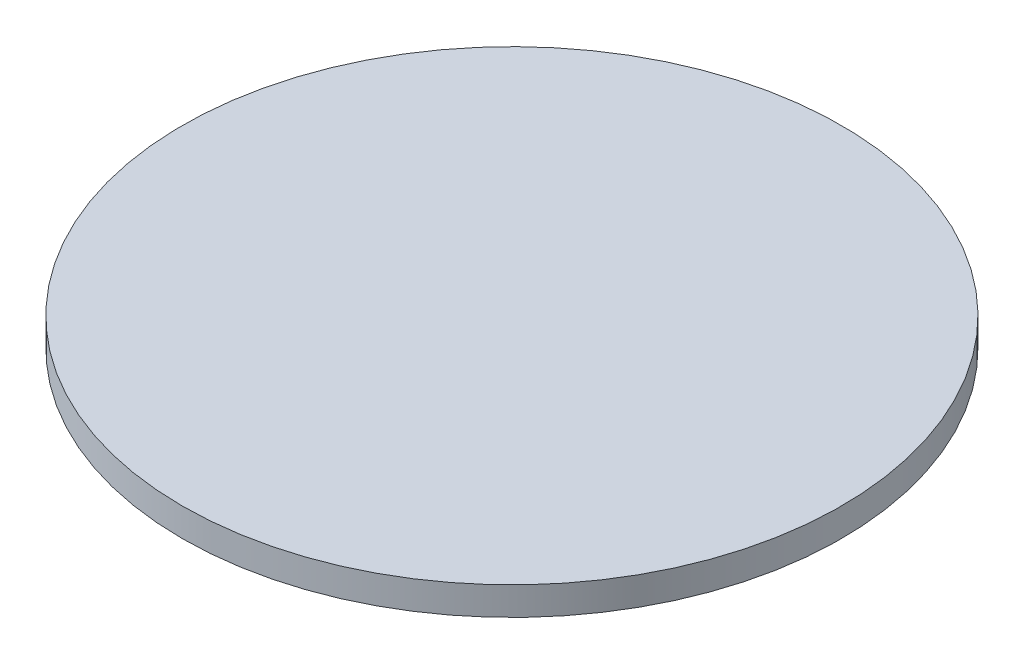
ISO-10303-21;
HEADER;
FILE_DESCRIPTION(('STEP AP214'),'2;1');
FILE_NAME('part.step','',(''),(''),'','','');
FILE_SCHEMA(('AUTOMOTIVE_DESIGN { 1 0 10303 214 1 1 1 1 }'));
ENDSEC;
DATA;
#1=APPLICATION_CONTEXT('core data for automotive mechanical design processes');
#2=APPLICATION_PROTOCOL_DEFINITION('international standard','automotive_design',2000,#1);
#3=PRODUCT_CONTEXT('',#1,'mechanical');
#4=PRODUCT('Part','Part','',(#3));
#5=PRODUCT_RELATED_PRODUCT_CATEGORY('part','',(#4));
#6=PRODUCT_DEFINITION_FORMATION('','',#4);
#7=PRODUCT_DEFINITION_CONTEXT('part definition',#1,'design');
#8=PRODUCT_DEFINITION('design','',#6,#7);
#9=PRODUCT_DEFINITION_SHAPE('','',#8);
#10=(LENGTH_UNIT() NAMED_UNIT(*) SI_UNIT(.MILLI.,.METRE.));
#11=(NAMED_UNIT(*) PLANE_ANGLE_UNIT() SI_UNIT($,.RADIAN.));
#12=(NAMED_UNIT(*) SI_UNIT($,.STERADIAN.) SOLID_ANGLE_UNIT());
#13=UNCERTAINTY_MEASURE_WITH_UNIT(LENGTH_MEASURE(1.E-05),#10,'distance_accuracy_value','');
#14=(GEOMETRIC_REPRESENTATION_CONTEXT(3) GLOBAL_UNCERTAINTY_ASSIGNED_CONTEXT((#13)) GLOBAL_UNIT_ASSIGNED_CONTEXT((#10,
#11,#12)) REPRESENTATION_CONTEXT('',''));
#15=CARTESIAN_POINT('',(0.,0.,0.));
#16=DIRECTION('',(0.,0.,1.));
#17=DIRECTION('',(1.,0.,0.));
#18=AXIS2_PLACEMENT_3D('',#15,#16,#17);
#19=CARTESIAN_POINT('',(0.,0.,0.));
#20=DIRECTION('',(0.,1.,0.));
#21=DIRECTION('',(0.,0.,1.));
#22=AXIS2_PLACEMENT_3D('',#19,#20,#21);
#23=CONICAL_SURFACE('',#22,2.5,0.463647609000806);
#24=CARTESIAN_POINT('',(0.,5.,0.));
#25=DIRECTION('',(0.,1.,0.));
#26=DIRECTION('',(0.,0.,1.));
#27=AXIS2_PLACEMENT_3D('',#24,#25,#26);
#28=CIRCLE('',#27,5.);
#29=CARTESIAN_POINT('',(0.,5.,5.));
#30=VERTEX_POINT('',#29);
#31=EDGE_CURVE('E55',#30,#30,#28,.T.);
#32=ORIENTED_EDGE('',*,*,#31,.F.);
#33=EDGE_LOOP('',(#32));
#34=FACE_BOUND('',#33,.T.);
#35=CARTESIAN_POINT('',(0.,0.,0.));
#36=DIRECTION('',(0.,-1.,0.));
#37=DIRECTION('',(0.,0.,-1.));
#38=AXIS2_PLACEMENT_3D('',#35,#36,#37);
#39=CIRCLE('',#38,2.5);
#40=CARTESIAN_POINT('',(0.,0.,-2.5));
#41=VERTEX_POINT('',#40);
#42=EDGE_CURVE('E50',#41,#41,#39,.T.);
#43=ORIENTED_EDGE('',*,*,#42,.F.);
#44=EDGE_LOOP('',(#43));
#45=FACE_BOUND('',#44,.T.);
#46=ADVANCED_FACE('F42',(#34,#45),#23,.T.);
#47=CARTESIAN_POINT('',(0.,0.,0.));
#48=DIRECTION('',(0.,-1.,0.));
#49=DIRECTION('',(0.,0.,-1.));
#50=AXIS2_PLACEMENT_3D('',#47,#48,#49);
#51=PLANE('',#50);
#52=CARTESIAN_POINT('',(0.,0.,0.));
#53=DIRECTION('',(0.,-1.,0.));
#54=DIRECTION('',(0.,0.,-1.));
#55=AXIS2_PLACEMENT_3D('',#52,#53,#54);
#56=CIRCLE('',#55,1.7);
#57=CARTESIAN_POINT('',(0.,0.,-1.7));
#58=VERTEX_POINT('',#57);
#59=EDGE_CURVE('E71',#58,#58,#56,.T.);
#60=ORIENTED_EDGE('',*,*,#59,.F.);
#61=EDGE_LOOP('',(#60));
#62=FACE_BOUND('',#61,.T.);
#63=ORIENTED_EDGE('',*,*,#42,.T.);
#64=EDGE_LOOP('',(#63));
#65=FACE_BOUND('',#64,.T.);
#66=ADVANCED_FACE('F88',(#62,#65),#51,.T.);
#67=CARTESIAN_POINT('',(0.,11.5,0.));
#68=DIRECTION('',(0.,-1.,0.));
#69=DIRECTION('',(0.,0.,-1.));
#70=AXIS2_PLACEMENT_3D('',#67,#68,#69);
#71=CYLINDRICAL_SURFACE('',#70,17.5);
#72=CARTESIAN_POINT('',(0.,11.5,0.));
#73=DIRECTION('',(0.,1.,0.));
#74=DIRECTION('',(0.,0.,1.));
#75=AXIS2_PLACEMENT_3D('',#72,#73,#74);
#76=CIRCLE('',#75,17.5);
#77=CARTESIAN_POINT('',(0.,11.5,17.5));
#78=VERTEX_POINT('',#77);
#79=EDGE_CURVE('E60',#78,#78,#76,.T.);
#80=ORIENTED_EDGE('',*,*,#79,.F.);
#81=EDGE_LOOP('',(#80));
#82=FACE_BOUND('',#81,.T.);
#83=CARTESIAN_POINT('',(0.,10.,0.));
#84=DIRECTION('',(0.,1.,0.));
#85=DIRECTION('',(0.,0.,1.));
#86=AXIS2_PLACEMENT_3D('',#83,#84,#85);
#87=CIRCLE('',#86,17.5);
#88=CARTESIAN_POINT('',(0.,10.,17.5));
#89=VERTEX_POINT('',#88);
#90=EDGE_CURVE('E63',#89,#89,#87,.T.);
#91=ORIENTED_EDGE('',*,*,#90,.T.);
#92=EDGE_LOOP('',(#91));
#93=FACE_BOUND('',#92,.T.);
#94=ADVANCED_FACE('F90',(#82,#93),#71,.T.);
#95=CARTESIAN_POINT('',(0.,11.5,0.));
#96=DIRECTION('',(0.,1.,0.));
#97=DIRECTION('',(0.,0.,1.));
#98=AXIS2_PLACEMENT_3D('',#95,#96,#97);
#99=PLANE('',#98);
#100=ORIENTED_EDGE('',*,*,#79,.T.);
#101=EDGE_LOOP('',(#100));
#102=FACE_BOUND('',#101,.T.);
#103=ADVANCED_FACE('F96',(#102),#99,.T.);
#104=CARTESIAN_POINT('',(0.,10.,0.));
#105=DIRECTION('',(0.,1.,0.));
#106=DIRECTION('',(0.,0.,1.));
#107=AXIS2_PLACEMENT_3D('',#104,#105,#106);
#108=PLANE('',#107);
#109=CARTESIAN_POINT('',(0.,10.,0.));
#110=DIRECTION('',(0.,1.,0.));
#111=DIRECTION('',(0.,0.,1.));
#112=AXIS2_PLACEMENT_3D('',#109,#110,#111);
#113=CIRCLE('',#112,13.6602540378444);
#114=CARTESIAN_POINT('',(0.,10.,13.6602540378444));
#115=VERTEX_POINT('',#114);
#116=EDGE_CURVE('E10',#115,#115,#113,.T.);
#117=ORIENTED_EDGE('',*,*,#116,.T.);
#118=EDGE_LOOP('',(#117));
#119=FACE_BOUND('',#118,.T.);
#120=ORIENTED_EDGE('',*,*,#90,.F.);
#121=EDGE_LOOP('',(#120));
#122=FACE_BOUND('',#121,.T.);
#123=ADVANCED_FACE('F84',(#119,#122),#108,.F.);
#124=CARTESIAN_POINT('',(0.,7.,0.));
#125=DIRECTION('',(0.,-1.,0.));
#126=DIRECTION('',(0.,0.,-1.));
#127=AXIS2_PLACEMENT_3D('',#124,#125,#126);
#128=CYLINDRICAL_SURFACE('',#127,1.7);
#129=CARTESIAN_POINT('',(0.,7.,0.));
#130=DIRECTION('',(0.,-1.,0.));
#131=DIRECTION('',(0.,0.,-1.));
#132=AXIS2_PLACEMENT_3D('',#129,#130,#131);
#133=CIRCLE('',#132,1.7);
#134=CARTESIAN_POINT('',(0.,7.,-1.7));
#135=VERTEX_POINT('',#134);
#136=EDGE_CURVE('E67',#135,#135,#133,.T.);
#137=ORIENTED_EDGE('',*,*,#136,.F.);
#138=EDGE_LOOP('',(#137));
#139=FACE_BOUND('',#138,.T.);
#140=ORIENTED_EDGE('',*,*,#59,.T.);
#141=EDGE_LOOP('',(#140));
#142=FACE_BOUND('',#141,.T.);
#143=ADVANCED_FACE('F81',(#139,#142),#128,.F.);
#144=CARTESIAN_POINT('',(0.,7.,0.));
#145=DIRECTION('',(0.,-1.,0.));
#146=DIRECTION('',(0.,0.,-1.));
#147=AXIS2_PLACEMENT_3D('',#144,#145,#146);
#148=PLANE('',#147);
#149=ORIENTED_EDGE('',*,*,#136,.T.);
#150=EDGE_LOOP('',(#149));
#151=FACE_BOUND('',#150,.T.);
#152=ADVANCED_FACE('F79',(#151),#148,.T.);
#153=CARTESIAN_POINT('',(0.,0.,0.));
#154=DIRECTION('',(0.,1.,0.));
#155=DIRECTION('',(0.,0.,1.));
#156=AXIS2_PLACEMENT_3D('',#153,#154,#155);
#157=TOROIDAL_SURFACE('',#156,13.6602540378444,10.);
#158=ORIENTED_EDGE('',*,*,#31,.T.);
#159=EDGE_LOOP('',(#158));
#160=FACE_BOUND('',#159,.T.);
#161=ORIENTED_EDGE('',*,*,#116,.F.);
#162=EDGE_LOOP('',(#161));
#163=FACE_BOUND('',#162,.T.);
#164=ADVANCED_FACE('F44',(#160,#163),#157,.F.);
#165=CLOSED_SHELL('',(#46,#66,#94,#103,#123,#143,#152,#164));
#166=MANIFOLD_SOLID_BREP('B2',#165);
#167=ADVANCED_BREP_SHAPE_REPRESENTATION('',(#18,#166),#14);
#168=SHAPE_DEFINITION_REPRESENTATION(#9,#167);
ENDSEC;
END-ISO-10303-21;
